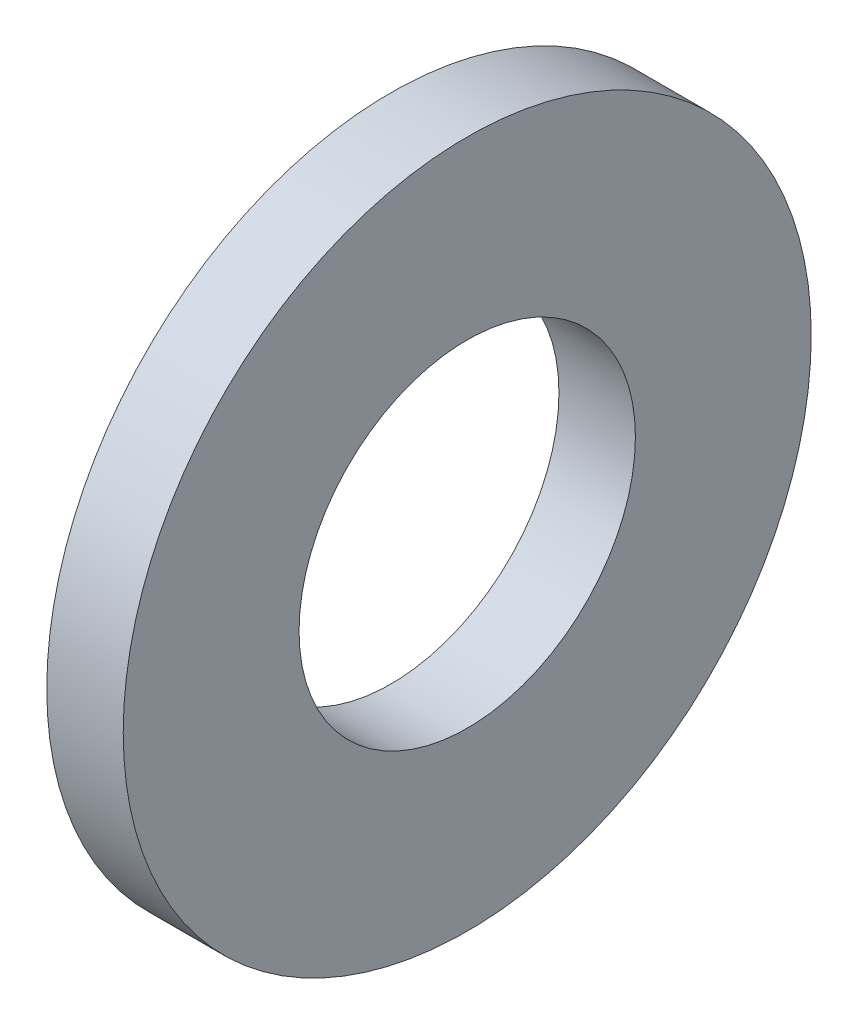
ISO-10303-21;
HEADER;
FILE_DESCRIPTION(('STEP AP214'),'2;1');
FILE_NAME('part.step','',(''),(''),'','','');
FILE_SCHEMA(('AUTOMOTIVE_DESIGN { 1 0 10303 214 1 1 1 1 }'));
ENDSEC;
DATA;
#1=APPLICATION_CONTEXT('core data for automotive mechanical design processes');
#2=APPLICATION_PROTOCOL_DEFINITION('international standard','automotive_design',2000,#1);
#3=PRODUCT_CONTEXT('',#1,'mechanical');
#4=PRODUCT('Part','Part','',(#3));
#5=PRODUCT_RELATED_PRODUCT_CATEGORY('part','',(#4));
#6=PRODUCT_DEFINITION_FORMATION('','',#4);
#7=PRODUCT_DEFINITION_CONTEXT('part definition',#1,'design');
#8=PRODUCT_DEFINITION('design','',#6,#7);
#9=PRODUCT_DEFINITION_SHAPE('','',#8);
#10=(LENGTH_UNIT() NAMED_UNIT(*) SI_UNIT(.MILLI.,.METRE.));
#11=(NAMED_UNIT(*) PLANE_ANGLE_UNIT() SI_UNIT($,.RADIAN.));
#12=(NAMED_UNIT(*) SI_UNIT($,.STERADIAN.) SOLID_ANGLE_UNIT());
#13=UNCERTAINTY_MEASURE_WITH_UNIT(LENGTH_MEASURE(1.E-05),#10,'distance_accuracy_value','');
#14=(GEOMETRIC_REPRESENTATION_CONTEXT(3) GLOBAL_UNCERTAINTY_ASSIGNED_CONTEXT((#13)) GLOBAL_UNIT_ASSIGNED_CONTEXT((#10,
#11,#12)) REPRESENTATION_CONTEXT('',''));
#15=CARTESIAN_POINT('',(0.,0.,0.));
#16=DIRECTION('',(0.,0.,1.));
#17=DIRECTION('',(1.,0.,0.));
#18=AXIS2_PLACEMENT_3D('',#15,#16,#17);
#19=CARTESIAN_POINT('',(2.,0.,0.));
#20=DIRECTION('',(1.,0.,0.));
#21=DIRECTION('',(0.,0.,-1.));
#22=AXIS2_PLACEMENT_3D('',#19,#20,#21);
#23=PLANE('',#22);
#24=CARTESIAN_POINT('',(2.,0.,0.));
#25=DIRECTION('',(1.,0.,0.));
#26=DIRECTION('',(0.,0.,-1.));
#27=AXIS2_PLACEMENT_3D('',#24,#25,#26);
#28=CIRCLE('',#27,9.);
#29=CARTESIAN_POINT('',(2.,0.,-9.));
#30=VERTEX_POINT('',#29);
#31=EDGE_CURVE('E10',#30,#30,#28,.T.);
#32=ORIENTED_EDGE('',*,*,#31,.T.);
#33=EDGE_LOOP('',(#32));
#34=FACE_BOUND('',#33,.T.);
#35=CARTESIAN_POINT('',(2.,0.,0.));
#36=DIRECTION('',(1.,0.,0.));
#37=DIRECTION('',(0.,0.,-1.));
#38=AXIS2_PLACEMENT_3D('',#35,#36,#37);
#39=CIRCLE('',#38,4.4);
#40=CARTESIAN_POINT('',(2.,0.,-4.4));
#41=VERTEX_POINT('',#40);
#42=EDGE_CURVE('E43',#41,#41,#39,.T.);
#43=ORIENTED_EDGE('',*,*,#42,.F.);
#44=EDGE_LOOP('',(#43));
#45=FACE_BOUND('',#44,.T.);
#46=ADVANCED_FACE('F32',(#34,#45),#23,.T.);
#47=CARTESIAN_POINT('',(0.,0.,0.));
#48=DIRECTION('',(1.,0.,0.));
#49=DIRECTION('',(0.,0.,-1.));
#50=AXIS2_PLACEMENT_3D('',#47,#48,#49);
#51=PLANE('',#50);
#52=CARTESIAN_POINT('',(0.,0.,0.));
#53=DIRECTION('',(1.,0.,0.));
#54=DIRECTION('',(0.,0.,-1.));
#55=AXIS2_PLACEMENT_3D('',#52,#53,#54);
#56=CIRCLE('',#55,9.);
#57=CARTESIAN_POINT('',(0.,0.,-9.));
#58=VERTEX_POINT('',#57);
#59=EDGE_CURVE('E36',#58,#58,#56,.T.);
#60=ORIENTED_EDGE('',*,*,#59,.F.);
#61=EDGE_LOOP('',(#60));
#62=FACE_BOUND('',#61,.T.);
#63=CARTESIAN_POINT('',(0.,0.,0.));
#64=DIRECTION('',(1.,0.,0.));
#65=DIRECTION('',(0.,0.,-1.));
#66=AXIS2_PLACEMENT_3D('',#63,#64,#65);
#67=CIRCLE('',#66,4.4);
#68=CARTESIAN_POINT('',(0.,0.,-4.4));
#69=VERTEX_POINT('',#68);
#70=EDGE_CURVE('E45',#69,#69,#67,.T.);
#71=ORIENTED_EDGE('',*,*,#70,.T.);
#72=EDGE_LOOP('',(#71));
#73=FACE_BOUND('',#72,.T.);
#74=ADVANCED_FACE('F55',(#62,#73),#51,.F.);
#75=CARTESIAN_POINT('',(2.,0.,0.));
#76=DIRECTION('',(-1.,0.,0.));
#77=DIRECTION('',(0.,0.,1.));
#78=AXIS2_PLACEMENT_3D('',#75,#76,#77);
#79=CYLINDRICAL_SURFACE('',#78,9.);
#80=ORIENTED_EDGE('',*,*,#31,.F.);
#81=EDGE_LOOP('',(#80));
#82=FACE_BOUND('',#81,.T.);
#83=ORIENTED_EDGE('',*,*,#59,.T.);
#84=EDGE_LOOP('',(#83));
#85=FACE_BOUND('',#84,.T.);
#86=ADVANCED_FACE('F34',(#82,#85),#79,.T.);
#87=CARTESIAN_POINT('',(2.,0.,0.));
#88=DIRECTION('',(-1.,0.,0.));
#89=DIRECTION('',(0.,0.,1.));
#90=AXIS2_PLACEMENT_3D('',#87,#88,#89);
#91=CYLINDRICAL_SURFACE('',#90,4.4);
#92=ORIENTED_EDGE('',*,*,#42,.T.);
#93=EDGE_LOOP('',(#92));
#94=FACE_BOUND('',#93,.T.);
#95=ORIENTED_EDGE('',*,*,#70,.F.);
#96=EDGE_LOOP('',(#95));
#97=FACE_BOUND('',#96,.T.);
#98=ADVANCED_FACE('F51',(#94,#97),#91,.F.);
#99=CLOSED_SHELL('',(#46,#74,#86,#98));
#100=MANIFOLD_SOLID_BREP('B2',#99);
#101=ADVANCED_BREP_SHAPE_REPRESENTATION('',(#18,#100),#14);
#102=SHAPE_DEFINITION_REPRESENTATION(#9,#101);
ENDSEC;
END-ISO-10303-21;
